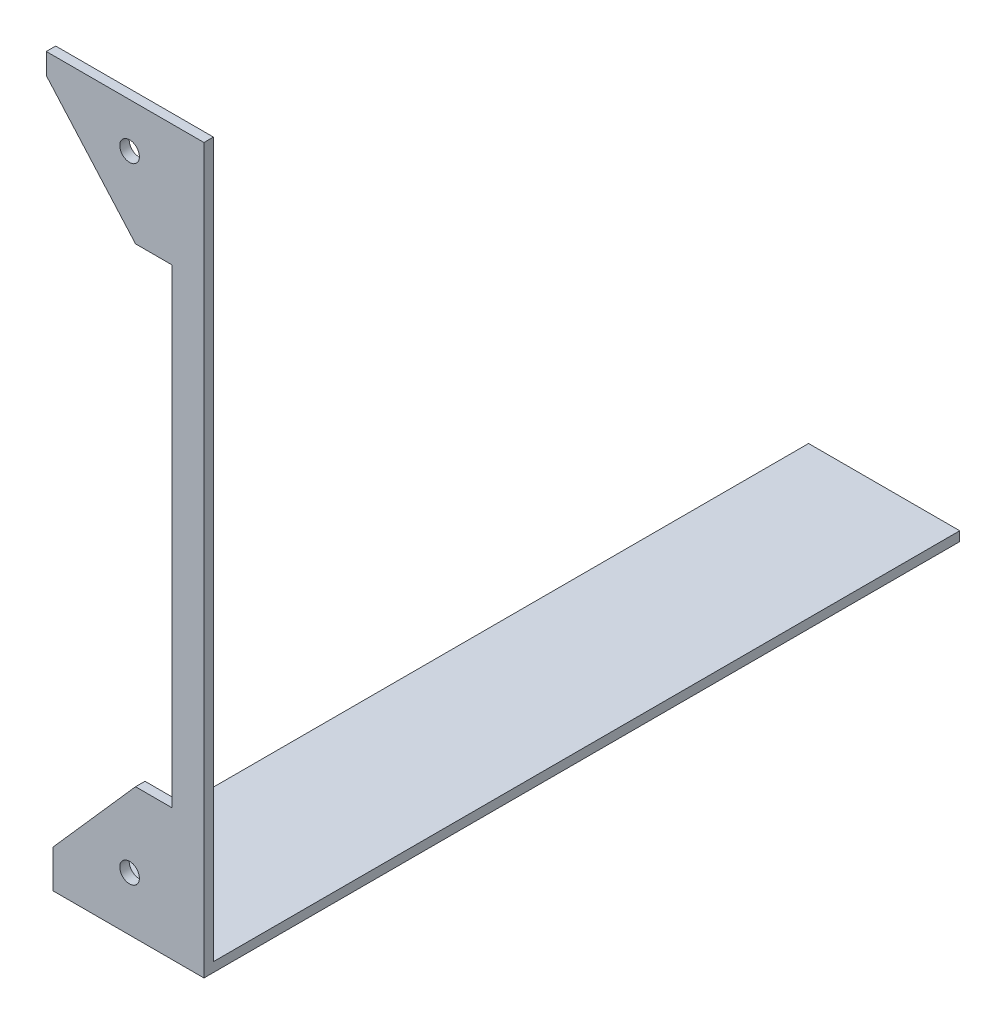
ISO-10303-21;
HEADER;
FILE_DESCRIPTION(('STEP AP214'),'2;1');
FILE_NAME('part.step','',(''),(''),'','','');
FILE_SCHEMA(('AUTOMOTIVE_DESIGN { 1 0 10303 214 1 1 1 1 }'));
ENDSEC;
DATA;
#1=APPLICATION_CONTEXT('core data for automotive mechanical design processes');
#2=APPLICATION_PROTOCOL_DEFINITION('international standard','automotive_design',2000,#1);
#3=PRODUCT_CONTEXT('',#1,'mechanical');
#4=PRODUCT('Part','Part','',(#3));
#5=PRODUCT_RELATED_PRODUCT_CATEGORY('part','',(#4));
#6=PRODUCT_DEFINITION_FORMATION('','',#4);
#7=PRODUCT_DEFINITION_CONTEXT('part definition',#1,'design');
#8=PRODUCT_DEFINITION('design','',#6,#7);
#9=PRODUCT_DEFINITION_SHAPE('','',#8);
#10=(LENGTH_UNIT() NAMED_UNIT(*) SI_UNIT(.MILLI.,.METRE.));
#11=(NAMED_UNIT(*) PLANE_ANGLE_UNIT() SI_UNIT($,.RADIAN.));
#12=(NAMED_UNIT(*) SI_UNIT($,.STERADIAN.) SOLID_ANGLE_UNIT());
#13=UNCERTAINTY_MEASURE_WITH_UNIT(LENGTH_MEASURE(1.E-05),#10,'distance_accuracy_value','');
#14=(GEOMETRIC_REPRESENTATION_CONTEXT(3) GLOBAL_UNCERTAINTY_ASSIGNED_CONTEXT((#13)) GLOBAL_UNIT_ASSIGNED_CONTEXT((#10,
#11,#12)) REPRESENTATION_CONTEXT('',''));
#15=CARTESIAN_POINT('',(0.,0.,0.));
#16=DIRECTION('',(0.,0.,1.));
#17=DIRECTION('',(1.,0.,0.));
#18=AXIS2_PLACEMENT_3D('',#15,#16,#17);
#19=CARTESIAN_POINT('',(-16.6361867704281,14.6789883268482,1.5875));
#20=DIRECTION('',(0.749837855365091,-0.661621637086848,0.));
#21=DIRECTION('',(0.661621637086848,0.749837855365091,0.));
#22=AXIS2_PLACEMENT_3D('',#19,#20,#21);
#23=PLANE('',#22);
#24=DIRECTION('',(-0.661621637086849,-0.749837855365093,0.));
#25=VECTOR('',#24,1.);
#26=CARTESIAN_POINT('',(-16.6361867704281,14.6789883268482,0.));
#27=LINE('',#26,#25);
#28=CARTESIAN_POINT('',(-11.5,20.5,0.));
#29=VERTEX_POINT('',#28);
#30=CARTESIAN_POINT('',(-25.4000000000002,4.74666666666666,0.));
#31=VERTEX_POINT('',#30);
#32=EDGE_CURVE('E151',#29,#31,#27,.T.);
#33=ORIENTED_EDGE('',*,*,#32,.T.);
#34=DIRECTION('',(0.,0.,-1.));
#35=VECTOR('',#34,1.);
#36=CARTESIAN_POINT('',(-25.4000000000002,4.74666666666666,1.5875));
#37=LINE('',#36,#35);
#38=CARTESIAN_POINT('',(-25.4000000000002,4.74666666666666,1.5875));
#39=VERTEX_POINT('',#38);
#40=EDGE_CURVE('E11',#39,#31,#37,.T.);
#41=ORIENTED_EDGE('',*,*,#40,.F.);
#42=DIRECTION('',(-0.661621637086849,-0.749837855365093,0.));
#43=VECTOR('',#42,1.);
#44=CARTESIAN_POINT('',(-16.6361867704281,14.6789883268482,1.5875));
#45=LINE('',#44,#43);
#46=CARTESIAN_POINT('',(-11.5,20.5,1.5875));
#47=VERTEX_POINT('',#46);
#48=EDGE_CURVE('E212',#47,#39,#45,.T.);
#49=ORIENTED_EDGE('',*,*,#48,.F.);
#50=DIRECTION('',(0.,0.,-1.));
#51=VECTOR('',#50,1.);
#52=CARTESIAN_POINT('',(-11.5,20.5,1.5875));
#53=LINE('',#52,#51);
#54=EDGE_CURVE('E140',#47,#29,#53,.T.);
#55=ORIENTED_EDGE('',*,*,#54,.T.);
#56=EDGE_LOOP('',(#33,#41,#49,#55));
#57=FACE_BOUND('',#56,.T.);
#58=ADVANCED_FACE('F39',(#57),#23,.F.);
#59=CARTESIAN_POINT('',(-25.4000000000002,0.,1.5875));
#60=DIRECTION('',(1.,0.,0.));
#61=DIRECTION('',(0.,1.,0.));
#62=AXIS2_PLACEMENT_3D('',#59,#60,#61);
#63=PLANE('',#62);
#64=DIRECTION('',(0.,-1.,0.));
#65=VECTOR('',#64,1.);
#66=CARTESIAN_POINT('',(-25.4000000000002,0.,0.));
#67=LINE('',#66,#65);
#68=CARTESIAN_POINT('',(-25.4000000000002,0.,0.));
#69=VERTEX_POINT('',#68);
#70=EDGE_CURVE('E154',#31,#69,#67,.T.);
#71=ORIENTED_EDGE('',*,*,#70,.T.);
#72=DIRECTION('',(0.,0.,1.));
#73=VECTOR('',#72,1.);
#74=CARTESIAN_POINT('',(-25.4000000000002,0.,-125.4125));
#75=LINE('',#74,#73);
#76=CARTESIAN_POINT('',(-25.4000000000002,0.,-125.4125));
#77=VERTEX_POINT('',#76);
#78=EDGE_CURVE('E224',#77,#69,#75,.T.);
#79=ORIENTED_EDGE('',*,*,#78,.F.);
#80=DIRECTION('',(0.,1.,0.));
#81=VECTOR('',#80,1.);
#82=CARTESIAN_POINT('',(-25.4000000000002,-1.5875,-125.4125));
#83=LINE('',#82,#81);
#84=CARTESIAN_POINT('',(-25.4000000000002,-1.5875,-125.4125));
#85=VERTEX_POINT('',#84);
#86=EDGE_CURVE('E148',#85,#77,#83,.T.);
#87=ORIENTED_EDGE('',*,*,#86,.F.);
#88=DIRECTION('',(0.,0.,1.));
#89=VECTOR('',#88,1.);
#90=CARTESIAN_POINT('',(-25.4000000000002,-1.5875,-125.4125));
#91=LINE('',#90,#89);
#92=CARTESIAN_POINT('',(-25.4000000000002,-1.5875,1.5875));
#93=VERTEX_POINT('',#92);
#94=EDGE_CURVE('E221',#85,#93,#91,.T.);
#95=ORIENTED_EDGE('',*,*,#94,.T.);
#96=DIRECTION('',(0.,-1.,0.));
#97=VECTOR('',#96,1.);
#98=CARTESIAN_POINT('',(-25.4000000000002,0.,1.5875));
#99=LINE('',#98,#97);
#100=EDGE_CURVE('E103',#39,#93,#99,.T.);
#101=ORIENTED_EDGE('',*,*,#100,.F.);
#102=ORIENTED_EDGE('',*,*,#40,.T.);
#103=EDGE_LOOP('',(#71,#79,#87,#95,#101,#102));
#104=FACE_BOUND('',#103,.T.);
#105=ADVANCED_FACE('F252',(#104),#63,.F.);
#106=CARTESIAN_POINT('',(0.,0.,1.5875));
#107=DIRECTION('',(1.,0.,0.));
#108=DIRECTION('',(0.,1.,0.));
#109=AXIS2_PLACEMENT_3D('',#106,#107,#108);
#110=PLANE('',#109);
#111=DIRECTION('',(0.,-1.,0.));
#112=VECTOR('',#111,1.);
#113=CARTESIAN_POINT('',(0.,0.,0.));
#114=LINE('',#113,#112);
#115=CARTESIAN_POINT('',(0.,120.,0.));
#116=VERTEX_POINT('',#115);
#117=CARTESIAN_POINT('',(0.,0.,0.));
#118=VERTEX_POINT('',#117);
#119=EDGE_CURVE('E160',#116,#118,#114,.T.);
#120=ORIENTED_EDGE('',*,*,#119,.F.);
#121=DIRECTION('',(0.,0.,-1.));
#122=VECTOR('',#121,1.);
#123=CARTESIAN_POINT('',(0.,120.,1.5875));
#124=LINE('',#123,#122);
#125=CARTESIAN_POINT('',(0.,120.,1.5875));
#126=VERTEX_POINT('',#125);
#127=EDGE_CURVE('E48',#126,#116,#124,.T.);
#128=ORIENTED_EDGE('',*,*,#127,.F.);
#129=DIRECTION('',(0.,-1.,0.));
#130=VECTOR('',#129,1.);
#131=CARTESIAN_POINT('',(0.,0.,1.5875));
#132=LINE('',#131,#130);
#133=CARTESIAN_POINT('',(0.,-1.5875,1.5875));
#134=VERTEX_POINT('',#133);
#135=EDGE_CURVE('E206',#126,#134,#132,.T.);
#136=ORIENTED_EDGE('',*,*,#135,.T.);
#137=DIRECTION('',(0.,0.,-1.));
#138=VECTOR('',#137,1.);
#139=CARTESIAN_POINT('',(0.,-1.5875,1.5875));
#140=LINE('',#139,#138);
#141=CARTESIAN_POINT('',(0.,-1.5875,-125.4125));
#142=VERTEX_POINT('',#141);
#143=EDGE_CURVE('E235',#134,#142,#140,.T.);
#144=ORIENTED_EDGE('',*,*,#143,.T.);
#145=DIRECTION('',(0.,1.,0.));
#146=VECTOR('',#145,1.);
#147=CARTESIAN_POINT('',(0.,-1.5875,-125.4125));
#148=LINE('',#147,#146);
#149=CARTESIAN_POINT('',(0.,0.,-125.4125));
#150=VERTEX_POINT('',#149);
#151=EDGE_CURVE('E219',#142,#150,#148,.T.);
#152=ORIENTED_EDGE('',*,*,#151,.T.);
#153=DIRECTION('',(0.,0.,-1.));
#154=VECTOR('',#153,1.);
#155=CARTESIAN_POINT('',(0.,0.,1.5875));
#156=LINE('',#155,#154);
#157=EDGE_CURVE('E195',#118,#150,#156,.T.);
#158=ORIENTED_EDGE('',*,*,#157,.F.);
#159=EDGE_LOOP('',(#120,#128,#136,#144,#152,#158));
#160=FACE_BOUND('',#159,.T.);
#161=ADVANCED_FACE('F192',(#160),#110,.T.);
#162=CARTESIAN_POINT('',(0.,120.,1.5875));
#163=DIRECTION('',(0.,1.,0.));
#164=DIRECTION('',(-1.,0.,0.));
#165=AXIS2_PLACEMENT_3D('',#162,#163,#164);
#166=PLANE('',#165);
#167=DIRECTION('',(1.00000000000001,0.,0.));
#168=VECTOR('',#167,1.);
#169=CARTESIAN_POINT('',(0.,120.,0.));
#170=LINE('',#169,#168);
#171=CARTESIAN_POINT('',(-26.5000000000002,120.,0.));
#172=VERTEX_POINT('',#171);
#173=EDGE_CURVE('E163',#172,#116,#170,.T.);
#174=ORIENTED_EDGE('',*,*,#173,.F.);
#175=DIRECTION('',(0.,0.,-1.));
#176=VECTOR('',#175,1.);
#177=CARTESIAN_POINT('',(-26.5000000000002,120.,1.5875));
#178=LINE('',#177,#176);
#179=CARTESIAN_POINT('',(-26.5000000000002,120.,1.5875));
#180=VERTEX_POINT('',#179);
#181=EDGE_CURVE('E180',#180,#172,#178,.T.);
#182=ORIENTED_EDGE('',*,*,#181,.F.);
#183=DIRECTION('',(1.00000000000001,0.,0.));
#184=VECTOR('',#183,1.);
#185=CARTESIAN_POINT('',(0.,120.,1.5875));
#186=LINE('',#185,#184);
#187=EDGE_CURVE('E187',#180,#126,#186,.T.);
#188=ORIENTED_EDGE('',*,*,#187,.T.);
#189=ORIENTED_EDGE('',*,*,#127,.T.);
#190=EDGE_LOOP('',(#174,#182,#188,#189));
#191=FACE_BOUND('',#190,.T.);
#192=ADVANCED_FACE('F185',(#191),#166,.T.);
#193=CARTESIAN_POINT('',(-26.5000000000003,0.,1.5875));
#194=DIRECTION('',(-1.,0.,0.));
#195=DIRECTION('',(0.,-1.,0.));
#196=AXIS2_PLACEMENT_3D('',#193,#194,#195);
#197=PLANE('',#196);
#198=DIRECTION('',(0.,1.,0.));
#199=VECTOR('',#198,1.);
#200=CARTESIAN_POINT('',(-26.5000000000003,0.,0.));
#201=LINE('',#200,#199);
#202=CARTESIAN_POINT('',(-26.5000000000002,116.5,0.));
#203=VERTEX_POINT('',#202);
#204=EDGE_CURVE('E166',#203,#172,#201,.T.);
#205=ORIENTED_EDGE('',*,*,#204,.F.);
#206=DIRECTION('',(0.,0.,-1.));
#207=VECTOR('',#206,1.);
#208=CARTESIAN_POINT('',(-26.5000000000002,116.5,1.5875));
#209=LINE('',#208,#207);
#210=CARTESIAN_POINT('',(-26.5000000000002,116.5,1.5875));
#211=VERTEX_POINT('',#210);
#212=EDGE_CURVE('E178',#211,#203,#209,.T.);
#213=ORIENTED_EDGE('',*,*,#212,.F.);
#214=DIRECTION('',(0.,1.,0.));
#215=VECTOR('',#214,1.);
#216=CARTESIAN_POINT('',(-26.5000000000003,0.,1.5875));
#217=LINE('',#216,#215);
#218=EDGE_CURVE('E204',#211,#180,#217,.T.);
#219=ORIENTED_EDGE('',*,*,#218,.T.);
#220=ORIENTED_EDGE('',*,*,#181,.T.);
#221=EDGE_LOOP('',(#205,#213,#219,#220));
#222=FACE_BOUND('',#221,.T.);
#223=ADVANCED_FACE('F202',(#222),#197,.T.);
#224=CARTESIAN_POINT('',(42.8968871595333,37.8501945525292,1.5875));
#225=DIRECTION('',(0.749837855365091,0.661621637086848,0.));
#226=DIRECTION('',(-0.661621637086848,0.749837855365091,0.));
#227=AXIS2_PLACEMENT_3D('',#224,#225,#226);
#228=PLANE('',#227);
#229=DIRECTION('',(0.661621637086849,-0.749837855365093,0.));
#230=VECTOR('',#229,1.);
#231=CARTESIAN_POINT('',(42.8968871595333,37.8501945525292,0.));
#232=LINE('',#231,#230);
#233=CARTESIAN_POINT('',(-11.5000000000001,99.5,0.));
#234=VERTEX_POINT('',#233);
#235=EDGE_CURVE('E169',#203,#234,#232,.T.);
#236=ORIENTED_EDGE('',*,*,#235,.T.);
#237=DIRECTION('',(0.,0.,-1.));
#238=VECTOR('',#237,1.);
#239=CARTESIAN_POINT('',(-11.5000000000001,99.5,1.5875));
#240=LINE('',#239,#238);
#241=CARTESIAN_POINT('',(-11.5000000000001,99.5,1.5875));
#242=VERTEX_POINT('',#241);
#243=EDGE_CURVE('E135',#242,#234,#240,.T.);
#244=ORIENTED_EDGE('',*,*,#243,.F.);
#245=DIRECTION('',(0.661621637086849,-0.749837855365093,0.));
#246=VECTOR('',#245,1.);
#247=CARTESIAN_POINT('',(42.8968871595333,37.8501945525292,1.5875));
#248=LINE('',#247,#246);
#249=EDGE_CURVE('E126',#211,#242,#248,.T.);
#250=ORIENTED_EDGE('',*,*,#249,.F.);
#251=ORIENTED_EDGE('',*,*,#212,.T.);
#252=EDGE_LOOP('',(#236,#244,#250,#251));
#253=FACE_BOUND('',#252,.T.);
#254=ADVANCED_FACE('F380',(#253),#228,.F.);
#255=CARTESIAN_POINT('',(0.,99.5,1.5875));
#256=DIRECTION('',(0.,1.,0.));
#257=DIRECTION('',(-1.,0.,0.));
#258=AXIS2_PLACEMENT_3D('',#255,#256,#257);
#259=PLANE('',#258);
#260=DIRECTION('',(1.00000000000001,0.,0.));
#261=VECTOR('',#260,1.);
#262=CARTESIAN_POINT('',(0.,99.5,0.));
#263=LINE('',#262,#261);
#264=CARTESIAN_POINT('',(-5.40000000000002,99.5,0.));
#265=VERTEX_POINT('',#264);
#266=EDGE_CURVE('E134',#234,#265,#263,.T.);
#267=ORIENTED_EDGE('',*,*,#266,.T.);
#268=DIRECTION('',(0.,0.,-1.));
#269=VECTOR('',#268,1.);
#270=CARTESIAN_POINT('',(-5.40000000000002,99.5,1.5875));
#271=LINE('',#270,#269);
#272=CARTESIAN_POINT('',(-5.40000000000002,99.5,1.5875));
#273=VERTEX_POINT('',#272);
#274=EDGE_CURVE('E131',#273,#265,#271,.T.);
#275=ORIENTED_EDGE('',*,*,#274,.F.);
#276=DIRECTION('',(1.00000000000001,0.,0.));
#277=VECTOR('',#276,1.);
#278=CARTESIAN_POINT('',(0.,99.5,1.5875));
#279=LINE('',#278,#277);
#280=EDGE_CURVE('E119',#242,#273,#279,.T.);
#281=ORIENTED_EDGE('',*,*,#280,.F.);
#282=ORIENTED_EDGE('',*,*,#243,.T.);
#283=EDGE_LOOP('',(#267,#275,#281,#282));
#284=FACE_BOUND('',#283,.T.);
#285=ADVANCED_FACE('F132',(#284),#259,.F.);
#286=CARTESIAN_POINT('',(-5.40000000000002,0.,1.5875));
#287=DIRECTION('',(1.,0.,0.));
#288=DIRECTION('',(0.,1.,0.));
#289=AXIS2_PLACEMENT_3D('',#286,#287,#288);
#290=PLANE('',#289);
#291=DIRECTION('',(0.,-1.,0.));
#292=VECTOR('',#291,1.);
#293=CARTESIAN_POINT('',(-5.40000000000002,0.,0.));
#294=LINE('',#293,#292);
#295=CARTESIAN_POINT('',(-5.40000000000002,20.5,0.));
#296=VERTEX_POINT('',#295);
#297=EDGE_CURVE('E89',#265,#296,#294,.T.);
#298=ORIENTED_EDGE('',*,*,#297,.T.);
#299=DIRECTION('',(0.,0.,-1.));
#300=VECTOR('',#299,1.);
#301=CARTESIAN_POINT('',(-5.40000000000002,20.5,1.5875));
#302=LINE('',#301,#300);
#303=CARTESIAN_POINT('',(-5.40000000000002,20.5,1.5875));
#304=VERTEX_POINT('',#303);
#305=EDGE_CURVE('E136',#304,#296,#302,.T.);
#306=ORIENTED_EDGE('',*,*,#305,.F.);
#307=DIRECTION('',(0.,-1.,0.));
#308=VECTOR('',#307,1.);
#309=CARTESIAN_POINT('',(-5.40000000000002,0.,1.5875));
#310=LINE('',#309,#308);
#311=EDGE_CURVE('E123',#273,#304,#310,.T.);
#312=ORIENTED_EDGE('',*,*,#311,.F.);
#313=ORIENTED_EDGE('',*,*,#274,.T.);
#314=EDGE_LOOP('',(#298,#306,#312,#313));
#315=FACE_BOUND('',#314,.T.);
#316=ADVANCED_FACE('F138',(#315),#290,.F.);
#317=CARTESIAN_POINT('',(-12.5000000000001,112.5,1.5875));
#318=DIRECTION('',(0.,0.,-1.));
#319=DIRECTION('',(-1.,0.,0.));
#320=AXIS2_PLACEMENT_3D('',#317,#318,#319);
#321=CYLINDRICAL_SURFACE('',#320,1.65);
#322=CARTESIAN_POINT('',(-12.5000000000001,112.5,1.5875));
#323=DIRECTION('',(0.,0.,1.00000000000001));
#324=DIRECTION('',(1.00000000000001,0.,0.));
#325=AXIS2_PLACEMENT_3D('',#322,#323,#324);
#326=CIRCLE('',#325,1.65);
#327=CARTESIAN_POINT('',(-10.8500000000001,112.5,1.5875));
#328=VERTEX_POINT('',#327);
#329=EDGE_CURVE('E214',#328,#328,#326,.T.);
#330=ORIENTED_EDGE('',*,*,#329,.T.);
#331=EDGE_LOOP('',(#330));
#332=FACE_BOUND('',#331,.T.);
#333=CARTESIAN_POINT('',(-12.5000000000001,112.5,0.));
#334=DIRECTION('',(0.,0.,1.00000000000001));
#335=DIRECTION('',(1.00000000000001,0.,0.));
#336=AXIS2_PLACEMENT_3D('',#333,#334,#335);
#337=CIRCLE('',#336,1.65);
#338=CARTESIAN_POINT('',(-10.8500000000001,112.5,0.));
#339=VERTEX_POINT('',#338);
#340=EDGE_CURVE('E147',#339,#339,#337,.T.);
#341=ORIENTED_EDGE('',*,*,#340,.F.);
#342=EDGE_LOOP('',(#341));
#343=FACE_BOUND('',#342,.T.);
#344=ADVANCED_FACE('F278',(#332,#343),#321,.F.);
#345=CARTESIAN_POINT('',(-12.5000000000001,7.49999999999999,1.5875));
#346=DIRECTION('',(0.,0.,-1.));
#347=DIRECTION('',(-1.,0.,0.));
#348=AXIS2_PLACEMENT_3D('',#345,#346,#347);
#349=CYLINDRICAL_SURFACE('',#348,1.65);
#350=CARTESIAN_POINT('',(-12.5000000000001,7.49999999999999,1.5875));
#351=DIRECTION('',(0.,0.,1.00000000000001));
#352=DIRECTION('',(1.00000000000001,0.,0.));
#353=AXIS2_PLACEMENT_3D('',#350,#351,#352);
#354=CIRCLE('',#353,1.65);
#355=CARTESIAN_POINT('',(-10.8500000000001,7.49999999999999,1.5875));
#356=VERTEX_POINT('',#355);
#357=EDGE_CURVE('E174',#356,#356,#354,.T.);
#358=ORIENTED_EDGE('',*,*,#357,.T.);
#359=EDGE_LOOP('',(#358));
#360=FACE_BOUND('',#359,.T.);
#361=CARTESIAN_POINT('',(-12.5000000000001,7.49999999999999,0.));
#362=DIRECTION('',(0.,0.,1.00000000000001));
#363=DIRECTION('',(1.00000000000001,0.,0.));
#364=AXIS2_PLACEMENT_3D('',#361,#362,#363);
#365=CIRCLE('',#364,1.65);
#366=CARTESIAN_POINT('',(-10.8500000000001,7.49999999999999,0.));
#367=VERTEX_POINT('',#366);
#368=EDGE_CURVE('E144',#367,#367,#365,.T.);
#369=ORIENTED_EDGE('',*,*,#368,.F.);
#370=EDGE_LOOP('',(#369));
#371=FACE_BOUND('',#370,.T.);
#372=ADVANCED_FACE('F41',(#360,#371),#349,.F.);
#373=CARTESIAN_POINT('',(0.,20.5,1.5875));
#374=DIRECTION('',(0.,-1.,0.));
#375=DIRECTION('',(1.,0.,0.));
#376=AXIS2_PLACEMENT_3D('',#373,#374,#375);
#377=PLANE('',#376);
#378=DIRECTION('',(-1.00000000000001,0.,0.));
#379=VECTOR('',#378,1.);
#380=CARTESIAN_POINT('',(0.,20.5,0.));
#381=LINE('',#380,#379);
#382=EDGE_CURVE('E95',#296,#29,#381,.T.);
#383=ORIENTED_EDGE('',*,*,#382,.T.);
#384=ORIENTED_EDGE('',*,*,#54,.F.);
#385=DIRECTION('',(-1.00000000000001,0.,0.));
#386=VECTOR('',#385,1.);
#387=CARTESIAN_POINT('',(0.,20.5,1.5875));
#388=LINE('',#387,#386);
#389=EDGE_CURVE('E56',#304,#47,#388,.T.);
#390=ORIENTED_EDGE('',*,*,#389,.F.);
#391=ORIENTED_EDGE('',*,*,#305,.T.);
#392=EDGE_LOOP('',(#383,#384,#390,#391));
#393=FACE_BOUND('',#392,.T.);
#394=ADVANCED_FACE('F268',(#393),#377,.F.);
#395=CARTESIAN_POINT('',(0.,0.,1.5875));
#396=DIRECTION('',(0.,0.,1.00000000000001));
#397=DIRECTION('',(1.00000000000001,0.,0.));
#398=AXIS2_PLACEMENT_3D('',#395,#396,#397);
#399=PLANE('',#398);
#400=ORIENTED_EDGE('',*,*,#357,.F.);
#401=EDGE_LOOP('',(#400));
#402=FACE_BOUND('',#401,.T.);
#403=ORIENTED_EDGE('',*,*,#329,.F.);
#404=EDGE_LOOP('',(#403));
#405=FACE_BOUND('',#404,.T.);
#406=ORIENTED_EDGE('',*,*,#48,.T.);
#407=ORIENTED_EDGE('',*,*,#100,.T.);
#408=DIRECTION('',(1.,0.,0.));
#409=VECTOR('',#408,1.);
#410=CARTESIAN_POINT('',(0.,-1.5875,1.5875));
#411=LINE('',#410,#409);
#412=EDGE_CURVE('E226',#93,#134,#411,.T.);
#413=ORIENTED_EDGE('',*,*,#412,.T.);
#414=ORIENTED_EDGE('',*,*,#135,.F.);
#415=ORIENTED_EDGE('',*,*,#187,.F.);
#416=ORIENTED_EDGE('',*,*,#218,.F.);
#417=ORIENTED_EDGE('',*,*,#249,.T.);
#418=ORIENTED_EDGE('',*,*,#280,.T.);
#419=ORIENTED_EDGE('',*,*,#311,.T.);
#420=ORIENTED_EDGE('',*,*,#389,.T.);
#421=EDGE_LOOP('',(#406,#407,#413,#414,#415,#416,#417,#418,#419,#420));
#422=FACE_BOUND('',#421,.T.);
#423=ADVANCED_FACE('F121',(#402,#405,#422),#399,.T.);
#424=CARTESIAN_POINT('',(0.,0.,0.));
#425=DIRECTION('',(0.,0.,1.00000000000001));
#426=DIRECTION('',(1.00000000000001,0.,0.));
#427=AXIS2_PLACEMENT_3D('',#424,#425,#426);
#428=PLANE('',#427);
#429=ORIENTED_EDGE('',*,*,#368,.T.);
#430=EDGE_LOOP('',(#429));
#431=FACE_BOUND('',#430,.T.);
#432=ORIENTED_EDGE('',*,*,#340,.T.);
#433=EDGE_LOOP('',(#432));
#434=FACE_BOUND('',#433,.T.);
#435=ORIENTED_EDGE('',*,*,#32,.F.);
#436=ORIENTED_EDGE('',*,*,#382,.F.);
#437=ORIENTED_EDGE('',*,*,#297,.F.);
#438=ORIENTED_EDGE('',*,*,#266,.F.);
#439=ORIENTED_EDGE('',*,*,#235,.F.);
#440=ORIENTED_EDGE('',*,*,#204,.T.);
#441=ORIENTED_EDGE('',*,*,#173,.T.);
#442=ORIENTED_EDGE('',*,*,#119,.T.);
#443=DIRECTION('',(-1.00000000000001,0.,0.));
#444=VECTOR('',#443,1.);
#445=CARTESIAN_POINT('',(0.,0.,0.));
#446=LINE('',#445,#444);
#447=EDGE_CURVE('E157',#118,#69,#446,.T.);
#448=ORIENTED_EDGE('',*,*,#447,.T.);
#449=ORIENTED_EDGE('',*,*,#70,.F.);
#450=EDGE_LOOP('',(#435,#436,#437,#438,#439,#440,#441,#442,#448,#449));
#451=FACE_BOUND('',#450,.T.);
#452=ADVANCED_FACE('F198',(#431,#434,#451),#428,.F.);
#453=CARTESIAN_POINT('',(0.,0.,0.));
#454=DIRECTION('',(0.,1.,0.));
#455=DIRECTION('',(0.,0.,1.));
#456=AXIS2_PLACEMENT_3D('',#453,#454,#455);
#457=PLANE('',#456);
#458=ORIENTED_EDGE('',*,*,#447,.F.);
#459=ORIENTED_EDGE('',*,*,#157,.T.);
#460=DIRECTION('',(-1.,0.,0.));
#461=VECTOR('',#460,1.);
#462=CARTESIAN_POINT('',(0.,0.,-125.4125));
#463=LINE('',#462,#461);
#464=EDGE_CURVE('E227',#150,#77,#463,.T.);
#465=ORIENTED_EDGE('',*,*,#464,.T.);
#466=ORIENTED_EDGE('',*,*,#78,.T.);
#467=EDGE_LOOP('',(#458,#459,#465,#466));
#468=FACE_BOUND('',#467,.T.);
#469=ADVANCED_FACE('F264',(#468),#457,.T.);
#470=CARTESIAN_POINT('',(0.,-1.5875,-125.4125));
#471=DIRECTION('',(0.,0.,-1.));
#472=DIRECTION('',(-1.,0.,0.));
#473=AXIS2_PLACEMENT_3D('',#470,#471,#472);
#474=PLANE('',#473);
#475=ORIENTED_EDGE('',*,*,#464,.F.);
#476=ORIENTED_EDGE('',*,*,#151,.F.);
#477=DIRECTION('',(-1.,0.,0.));
#478=VECTOR('',#477,1.);
#479=CARTESIAN_POINT('',(0.,-1.5875,-125.4125));
#480=LINE('',#479,#478);
#481=EDGE_CURVE('E232',#142,#85,#480,.T.);
#482=ORIENTED_EDGE('',*,*,#481,.T.);
#483=ORIENTED_EDGE('',*,*,#86,.T.);
#484=EDGE_LOOP('',(#475,#476,#482,#483));
#485=FACE_BOUND('',#484,.T.);
#486=ADVANCED_FACE('F258',(#485),#474,.T.);
#487=CARTESIAN_POINT('',(0.,-1.5875,0.));
#488=DIRECTION('',(0.,1.,0.));
#489=DIRECTION('',(0.,0.,1.));
#490=AXIS2_PLACEMENT_3D('',#487,#488,#489);
#491=PLANE('',#490);
#492=ORIENTED_EDGE('',*,*,#412,.F.);
#493=ORIENTED_EDGE('',*,*,#94,.F.);
#494=ORIENTED_EDGE('',*,*,#481,.F.);
#495=ORIENTED_EDGE('',*,*,#143,.F.);
#496=EDGE_LOOP('',(#492,#493,#494,#495));
#497=FACE_BOUND('',#496,.T.);
#498=ADVANCED_FACE('F247',(#497),#491,.F.);
#499=CLOSED_SHELL('',(#58,#105,#161,#192,#223,#254,#285,#316,#344,#372,#394,#423,#452,#469,#486,#498));
#500=MANIFOLD_SOLID_BREP('B2',#499);
#501=ADVANCED_BREP_SHAPE_REPRESENTATION('',(#18,#500),#14);
#502=SHAPE_DEFINITION_REPRESENTATION(#9,#501);
ENDSEC;
END-ISO-10303-21;
